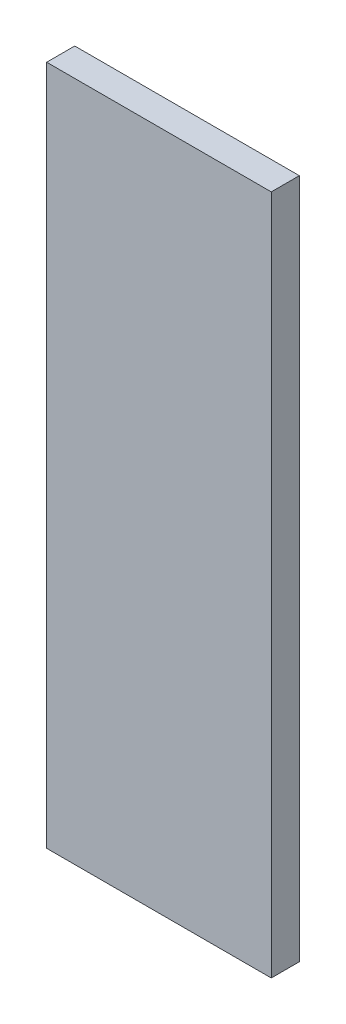
ISO-10303-21;
HEADER;
FILE_DESCRIPTION(('STEP AP214'),'2;1');
FILE_NAME('part.step','',(''),(''),'','','');
FILE_SCHEMA(('AUTOMOTIVE_DESIGN { 1 0 10303 214 1 1 1 1 }'));
ENDSEC;
DATA;
#1=APPLICATION_CONTEXT('core data for automotive mechanical design processes');
#2=APPLICATION_PROTOCOL_DEFINITION('international standard','automotive_design',2000,#1);
#3=PRODUCT_CONTEXT('',#1,'mechanical');
#4=PRODUCT('Part','Part','',(#3));
#5=PRODUCT_RELATED_PRODUCT_CATEGORY('part','',(#4));
#6=PRODUCT_DEFINITION_FORMATION('','',#4);
#7=PRODUCT_DEFINITION_CONTEXT('part definition',#1,'design');
#8=PRODUCT_DEFINITION('design','',#6,#7);
#9=PRODUCT_DEFINITION_SHAPE('','',#8);
#10=(LENGTH_UNIT() NAMED_UNIT(*) SI_UNIT(.MILLI.,.METRE.));
#11=(NAMED_UNIT(*) PLANE_ANGLE_UNIT() SI_UNIT($,.RADIAN.));
#12=(NAMED_UNIT(*) SI_UNIT($,.STERADIAN.) SOLID_ANGLE_UNIT());
#13=UNCERTAINTY_MEASURE_WITH_UNIT(LENGTH_MEASURE(1.E-05),#10,'distance_accuracy_value','');
#14=(GEOMETRIC_REPRESENTATION_CONTEXT(3) GLOBAL_UNCERTAINTY_ASSIGNED_CONTEXT((#13)) GLOBAL_UNIT_ASSIGNED_CONTEXT((#10,
#11,#12)) REPRESENTATION_CONTEXT('',''));
#15=CARTESIAN_POINT('',(0.,0.,0.));
#16=DIRECTION('',(0.,0.,1.));
#17=DIRECTION('',(1.,0.,0.));
#18=AXIS2_PLACEMENT_3D('',#15,#16,#17);
#19=CARTESIAN_POINT('',(25.4,-76.99375,6.35));
#20=DIRECTION('',(-1.,0.,0.));
#21=DIRECTION('',(0.,0.,1.));
#22=AXIS2_PLACEMENT_3D('',#19,#20,#21);
#23=PLANE('',#22);
#24=DIRECTION('',(0.,1.,0.));
#25=VECTOR('',#24,1.);
#26=CARTESIAN_POINT('',(25.4,-76.99375,0.));
#27=LINE('',#26,#25);
#28=CARTESIAN_POINT('',(25.4,-76.99375,0.));
#29=VERTEX_POINT('',#28);
#30=CARTESIAN_POINT('',(25.4,76.99375,0.));
#31=VERTEX_POINT('',#30);
#32=EDGE_CURVE('E98',#29,#31,#27,.T.);
#33=ORIENTED_EDGE('',*,*,#32,.T.);
#34=DIRECTION('',(0.,0.,-1.));
#35=VECTOR('',#34,1.);
#36=CARTESIAN_POINT('',(25.4,76.99375,6.35));
#37=LINE('',#36,#35);
#38=CARTESIAN_POINT('',(25.4,76.99375,6.35));
#39=VERTEX_POINT('',#38);
#40=EDGE_CURVE('E11',#39,#31,#37,.T.);
#41=ORIENTED_EDGE('',*,*,#40,.F.);
#42=DIRECTION('',(0.,1.,0.));
#43=VECTOR('',#42,1.);
#44=CARTESIAN_POINT('',(25.4,-76.99375,6.35));
#45=LINE('',#44,#43);
#46=CARTESIAN_POINT('',(25.4,-76.99375,6.35));
#47=VERTEX_POINT('',#46);
#48=EDGE_CURVE('E86',#47,#39,#45,.T.);
#49=ORIENTED_EDGE('',*,*,#48,.F.);
#50=DIRECTION('',(0.,0.,-1.));
#51=VECTOR('',#50,1.);
#52=CARTESIAN_POINT('',(25.4,-76.99375,6.35));
#53=LINE('',#52,#51);
#54=EDGE_CURVE('E94',#47,#29,#53,.T.);
#55=ORIENTED_EDGE('',*,*,#54,.T.);
#56=EDGE_LOOP('',(#33,#41,#49,#55));
#57=FACE_BOUND('',#56,.T.);
#58=ADVANCED_FACE('F35',(#57),#23,.F.);
#59=CARTESIAN_POINT('',(-25.4,76.99375,6.35));
#60=DIRECTION('',(0.,-1.,0.));
#61=DIRECTION('',(0.,0.,-1.));
#62=AXIS2_PLACEMENT_3D('',#59,#60,#61);
#63=PLANE('',#62);
#64=DIRECTION('',(-1.,0.,0.));
#65=VECTOR('',#64,1.);
#66=CARTESIAN_POINT('',(-25.4,76.99375,0.));
#67=LINE('',#66,#65);
#68=CARTESIAN_POINT('',(-25.4,76.99375,0.));
#69=VERTEX_POINT('',#68);
#70=EDGE_CURVE('E90',#31,#69,#67,.T.);
#71=ORIENTED_EDGE('',*,*,#70,.T.);
#72=DIRECTION('',(0.,0.,-1.));
#73=VECTOR('',#72,1.);
#74=CARTESIAN_POINT('',(-25.4,76.99375,6.35));
#75=LINE('',#74,#73);
#76=CARTESIAN_POINT('',(-25.4,76.99375,6.35));
#77=VERTEX_POINT('',#76);
#78=EDGE_CURVE('E43',#77,#69,#75,.T.);
#79=ORIENTED_EDGE('',*,*,#78,.F.);
#80=DIRECTION('',(-1.,0.,0.));
#81=VECTOR('',#80,1.);
#82=CARTESIAN_POINT('',(-25.4,76.99375,6.35));
#83=LINE('',#82,#81);
#84=EDGE_CURVE('E81',#39,#77,#83,.T.);
#85=ORIENTED_EDGE('',*,*,#84,.F.);
#86=ORIENTED_EDGE('',*,*,#40,.T.);
#87=EDGE_LOOP('',(#71,#79,#85,#86));
#88=FACE_BOUND('',#87,.T.);
#89=ADVANCED_FACE('F89',(#88),#63,.F.);
#90=CARTESIAN_POINT('',(-25.4,-76.99375,6.35));
#91=DIRECTION('',(1.,0.,0.));
#92=DIRECTION('',(0.,0.,-1.));
#93=AXIS2_PLACEMENT_3D('',#90,#91,#92);
#94=PLANE('',#93);
#95=DIRECTION('',(0.,-1.,0.));
#96=VECTOR('',#95,1.);
#97=CARTESIAN_POINT('',(-25.4,-76.99375,0.));
#98=LINE('',#97,#96);
#99=CARTESIAN_POINT('',(-25.4,-76.99375,0.));
#100=VERTEX_POINT('',#99);
#101=EDGE_CURVE('E68',#69,#100,#98,.T.);
#102=ORIENTED_EDGE('',*,*,#101,.T.);
#103=DIRECTION('',(0.,0.,-1.));
#104=VECTOR('',#103,1.);
#105=CARTESIAN_POINT('',(-25.4,-76.99375,6.35));
#106=LINE('',#105,#104);
#107=CARTESIAN_POINT('',(-25.4,-76.99375,6.35));
#108=VERTEX_POINT('',#107);
#109=EDGE_CURVE('E91',#108,#100,#106,.T.);
#110=ORIENTED_EDGE('',*,*,#109,.F.);
#111=DIRECTION('',(0.,-1.,0.));
#112=VECTOR('',#111,1.);
#113=CARTESIAN_POINT('',(-25.4,-76.99375,6.35));
#114=LINE('',#113,#112);
#115=EDGE_CURVE('E84',#77,#108,#114,.T.);
#116=ORIENTED_EDGE('',*,*,#115,.F.);
#117=ORIENTED_EDGE('',*,*,#78,.T.);
#118=EDGE_LOOP('',(#102,#110,#116,#117));
#119=FACE_BOUND('',#118,.T.);
#120=ADVANCED_FACE('F92',(#119),#94,.F.);
#121=CARTESIAN_POINT('',(-25.4,-76.99375,6.35));
#122=DIRECTION('',(0.,1.,0.));
#123=DIRECTION('',(0.,0.,1.));
#124=AXIS2_PLACEMENT_3D('',#121,#122,#123);
#125=PLANE('',#124);
#126=DIRECTION('',(1.,0.,0.));
#127=VECTOR('',#126,1.);
#128=CARTESIAN_POINT('',(-25.4,-76.99375,0.));
#129=LINE('',#128,#127);
#130=EDGE_CURVE('E74',#100,#29,#129,.T.);
#131=ORIENTED_EDGE('',*,*,#130,.T.);
#132=ORIENTED_EDGE('',*,*,#54,.F.);
#133=DIRECTION('',(1.,0.,0.));
#134=VECTOR('',#133,1.);
#135=CARTESIAN_POINT('',(-25.4,-76.99375,6.35));
#136=LINE('',#135,#134);
#137=EDGE_CURVE('E51',#108,#47,#136,.T.);
#138=ORIENTED_EDGE('',*,*,#137,.F.);
#139=ORIENTED_EDGE('',*,*,#109,.T.);
#140=EDGE_LOOP('',(#131,#132,#138,#139));
#141=FACE_BOUND('',#140,.T.);
#142=ADVANCED_FACE('F105',(#141),#125,.F.);
#143=CARTESIAN_POINT('',(0.,0.,6.35));
#144=DIRECTION('',(0.,0.,-1.));
#145=DIRECTION('',(-1.,0.,0.));
#146=AXIS2_PLACEMENT_3D('',#143,#144,#145);
#147=PLANE('',#146);
#148=ORIENTED_EDGE('',*,*,#48,.T.);
#149=ORIENTED_EDGE('',*,*,#84,.T.);
#150=ORIENTED_EDGE('',*,*,#115,.T.);
#151=ORIENTED_EDGE('',*,*,#137,.T.);
#152=EDGE_LOOP('',(#148,#149,#150,#151));
#153=FACE_BOUND('',#152,.T.);
#154=ADVANCED_FACE('F82',(#153),#147,.F.);
#155=CARTESIAN_POINT('',(0.,0.,0.));
#156=DIRECTION('',(0.,0.,-1.));
#157=DIRECTION('',(-1.,0.,0.));
#158=AXIS2_PLACEMENT_3D('',#155,#156,#157);
#159=PLANE('',#158);
#160=ORIENTED_EDGE('',*,*,#32,.F.);
#161=ORIENTED_EDGE('',*,*,#130,.F.);
#162=ORIENTED_EDGE('',*,*,#101,.F.);
#163=ORIENTED_EDGE('',*,*,#70,.F.);
#164=EDGE_LOOP('',(#160,#161,#162,#163));
#165=FACE_BOUND('',#164,.T.);
#166=ADVANCED_FACE('F108',(#165),#159,.T.);
#167=CLOSED_SHELL('',(#58,#89,#120,#142,#154,#166));
#168=MANIFOLD_SOLID_BREP('B2',#167);
#169=ADVANCED_BREP_SHAPE_REPRESENTATION('',(#18,#168),#14);
#170=SHAPE_DEFINITION_REPRESENTATION(#9,#169);
ENDSEC;
END-ISO-10303-21;
